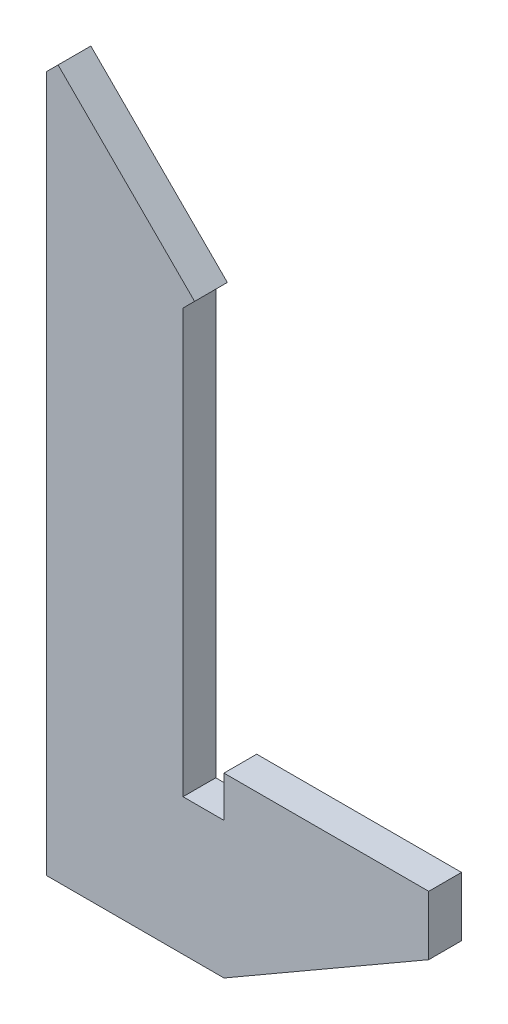
ISO-10303-21;
HEADER;
FILE_DESCRIPTION(('STEP AP214'),'2;1');
FILE_NAME('part.step','',(''),(''),'','','');
FILE_SCHEMA(('AUTOMOTIVE_DESIGN { 1 0 10303 214 1 1 1 1 }'));
ENDSEC;
DATA;
#1=APPLICATION_CONTEXT('core data for automotive mechanical design processes');
#2=APPLICATION_PROTOCOL_DEFINITION('international standard','automotive_design',2000,#1);
#3=PRODUCT_CONTEXT('',#1,'mechanical');
#4=PRODUCT('Part','Part','',(#3));
#5=PRODUCT_RELATED_PRODUCT_CATEGORY('part','',(#4));
#6=PRODUCT_DEFINITION_FORMATION('','',#4);
#7=PRODUCT_DEFINITION_CONTEXT('part definition',#1,'design');
#8=PRODUCT_DEFINITION('design','',#6,#7);
#9=PRODUCT_DEFINITION_SHAPE('','',#8);
#10=(LENGTH_UNIT() NAMED_UNIT(*) SI_UNIT(.MILLI.,.METRE.));
#11=(NAMED_UNIT(*) PLANE_ANGLE_UNIT() SI_UNIT($,.RADIAN.));
#12=(NAMED_UNIT(*) SI_UNIT($,.STERADIAN.) SOLID_ANGLE_UNIT());
#13=UNCERTAINTY_MEASURE_WITH_UNIT(LENGTH_MEASURE(1.E-05),#10,'distance_accuracy_value','');
#14=(GEOMETRIC_REPRESENTATION_CONTEXT(3) GLOBAL_UNCERTAINTY_ASSIGNED_CONTEXT((#13)) GLOBAL_UNIT_ASSIGNED_CONTEXT((#10,
#11,#12)) REPRESENTATION_CONTEXT('',''));
#15=CARTESIAN_POINT('',(0.,0.,0.));
#16=DIRECTION('',(0.,0.,1.));
#17=DIRECTION('',(1.,0.,0.));
#18=AXIS2_PLACEMENT_3D('',#15,#16,#17);
#19=CARTESIAN_POINT('',(-2.71514718625761,3.88485281374241,0.12));
#20=DIRECTION('',(0.707106781186544,-0.707106781186551,0.));
#21=DIRECTION('',(0.707106781186551,0.707106781186544,0.));
#22=AXIS2_PLACEMENT_3D('',#19,#20,#21);
#23=PLANE('',#22);
#24=DIRECTION('',(-0.707106781186551,-0.707106781186544,0.));
#25=VECTOR('',#24,1.);
#26=CARTESIAN_POINT('',(-2.71514718625761,3.88485281374241,-0.12));
#27=LINE('',#26,#25);
#28=CARTESIAN_POINT('',(-2.71514718625761,3.88485281374241,-0.12));
#29=VERTEX_POINT('',#28);
#30=CARTESIAN_POINT('',(-2.8,3.80000000000002,-0.12));
#31=VERTEX_POINT('',#30);
#32=EDGE_CURVE('E150',#29,#31,#27,.T.);
#33=ORIENTED_EDGE('',*,*,#32,.T.);
#34=DIRECTION('',(0.,0.,-1.));
#35=VECTOR('',#34,1.);
#36=CARTESIAN_POINT('',(-2.8,3.80000000000002,0.12));
#37=LINE('',#36,#35);
#38=CARTESIAN_POINT('',(-2.8,3.80000000000002,0.12));
#39=VERTEX_POINT('',#38);
#40=EDGE_CURVE('E11',#39,#31,#37,.T.);
#41=ORIENTED_EDGE('',*,*,#40,.F.);
#42=DIRECTION('',(-0.707106781186551,-0.707106781186544,0.));
#43=VECTOR('',#42,1.);
#44=CARTESIAN_POINT('',(-2.71514718625761,3.88485281374241,0.12));
#45=LINE('',#44,#43);
#46=CARTESIAN_POINT('',(-2.71514718625761,3.88485281374241,0.12));
#47=VERTEX_POINT('',#46);
#48=EDGE_CURVE('E170',#47,#39,#45,.T.);
#49=ORIENTED_EDGE('',*,*,#48,.F.);
#50=DIRECTION('',(0.,0.,-1.));
#51=VECTOR('',#50,1.);
#52=CARTESIAN_POINT('',(-2.71514718625761,3.88485281374241,0.12));
#53=LINE('',#52,#51);
#54=EDGE_CURVE('E146',#47,#29,#53,.T.);
#55=ORIENTED_EDGE('',*,*,#54,.T.);
#56=EDGE_LOOP('',(#33,#41,#49,#55));
#57=FACE_BOUND('',#56,.T.);
#58=ADVANCED_FACE('F36',(#57),#23,.F.);
#59=CARTESIAN_POINT('',(-2.8,3.80000000000002,0.12));
#60=DIRECTION('',(1.,0.,0.));
#61=DIRECTION('',(0.,1.,0.));
#62=AXIS2_PLACEMENT_3D('',#59,#60,#61);
#63=PLANE('',#62);
#64=DIRECTION('',(0.,-1.,0.));
#65=VECTOR('',#64,1.);
#66=CARTESIAN_POINT('',(-2.8,3.80000000000002,-0.12));
#67=LINE('',#66,#65);
#68=CARTESIAN_POINT('',(-2.8,-1.3,-0.12));
#69=VERTEX_POINT('',#68);
#70=EDGE_CURVE('E153',#31,#69,#67,.T.);
#71=ORIENTED_EDGE('',*,*,#70,.T.);
#72=DIRECTION('',(0.,0.,-1.));
#73=VECTOR('',#72,1.);
#74=CARTESIAN_POINT('',(-2.8,-1.3,0.12));
#75=LINE('',#74,#73);
#76=CARTESIAN_POINT('',(-2.8,-1.3,0.12));
#77=VERTEX_POINT('',#76);
#78=EDGE_CURVE('E44',#77,#69,#75,.T.);
#79=ORIENTED_EDGE('',*,*,#78,.F.);
#80=DIRECTION('',(0.,-1.,0.));
#81=VECTOR('',#80,1.);
#82=CARTESIAN_POINT('',(-2.8,3.80000000000002,0.12));
#83=LINE('',#82,#81);
#84=EDGE_CURVE('E104',#39,#77,#83,.T.);
#85=ORIENTED_EDGE('',*,*,#84,.F.);
#86=ORIENTED_EDGE('',*,*,#40,.T.);
#87=EDGE_LOOP('',(#71,#79,#85,#86));
#88=FACE_BOUND('',#87,.T.);
#89=ADVANCED_FACE('F242',(#88),#63,.F.);
#90=CARTESIAN_POINT('',(-2.8,-1.3,0.12));
#91=DIRECTION('',(0.,1.,0.));
#92=DIRECTION('',(0.,0.,1.));
#93=AXIS2_PLACEMENT_3D('',#90,#91,#92);
#94=PLANE('',#93);
#95=DIRECTION('',(1.,0.,0.));
#96=VECTOR('',#95,1.);
#97=CARTESIAN_POINT('',(-2.8,-1.3,-0.12));
#98=LINE('',#97,#96);
#99=CARTESIAN_POINT('',(-1.5,-1.3,-0.12));
#100=VERTEX_POINT('',#99);
#101=EDGE_CURVE('E155',#69,#100,#98,.T.);
#102=ORIENTED_EDGE('',*,*,#101,.T.);
#103=DIRECTION('',(0.,0.,-1.));
#104=VECTOR('',#103,1.);
#105=CARTESIAN_POINT('',(-1.5,-1.3,0.12));
#106=LINE('',#105,#104);
#107=CARTESIAN_POINT('',(-1.5,-1.3,0.12));
#108=VERTEX_POINT('',#107);
#109=EDGE_CURVE('E186',#108,#100,#106,.T.);
#110=ORIENTED_EDGE('',*,*,#109,.F.);
#111=DIRECTION('',(1.,0.,0.));
#112=VECTOR('',#111,1.);
#113=CARTESIAN_POINT('',(-2.8,-1.3,0.12));
#114=LINE('',#113,#112);
#115=EDGE_CURVE('E194',#77,#108,#114,.T.);
#116=ORIENTED_EDGE('',*,*,#115,.F.);
#117=ORIENTED_EDGE('',*,*,#78,.T.);
#118=EDGE_LOOP('',(#102,#110,#116,#117));
#119=FACE_BOUND('',#118,.T.);
#120=ADVANCED_FACE('F192',(#119),#94,.F.);
#121=CARTESIAN_POINT('',(-1.5,-1.3,0.12));
#122=DIRECTION('',(-0.499999999999998,0.86602540378444,0.));
#123=DIRECTION('',(-0.86602540378444,-0.499999999999998,0.));
#124=AXIS2_PLACEMENT_3D('',#121,#122,#123);
#125=PLANE('',#124);
#126=DIRECTION('',(0.86602540378444,0.499999999999998,0.));
#127=VECTOR('',#126,1.);
#128=CARTESIAN_POINT('',(-1.5,-1.3,-0.12));
#129=LINE('',#128,#127);
#130=CARTESIAN_POINT('',(0.,-0.433974596215566,-0.12));
#131=VERTEX_POINT('',#130);
#132=EDGE_CURVE('E157',#100,#131,#129,.T.);
#133=ORIENTED_EDGE('',*,*,#132,.T.);
#134=DIRECTION('',(0.,0.,-1.));
#135=VECTOR('',#134,1.);
#136=CARTESIAN_POINT('',(0.,-0.433974596215566,0.12));
#137=LINE('',#136,#135);
#138=CARTESIAN_POINT('',(0.,-0.433974596215566,0.12));
#139=VERTEX_POINT('',#138);
#140=EDGE_CURVE('E183',#139,#131,#137,.T.);
#141=ORIENTED_EDGE('',*,*,#140,.F.);
#142=DIRECTION('',(0.86602540378444,0.499999999999998,0.));
#143=VECTOR('',#142,1.);
#144=CARTESIAN_POINT('',(-1.5,-1.3,0.12));
#145=LINE('',#144,#143);
#146=EDGE_CURVE('E212',#108,#139,#145,.T.);
#147=ORIENTED_EDGE('',*,*,#146,.F.);
#148=ORIENTED_EDGE('',*,*,#109,.T.);
#149=EDGE_LOOP('',(#133,#141,#147,#148));
#150=FACE_BOUND('',#149,.T.);
#151=ADVANCED_FACE('F203',(#150),#125,.F.);
#152=CARTESIAN_POINT('',(0.,-0.433974596215566,0.12));
#153=DIRECTION('',(-1.,0.,0.));
#154=DIRECTION('',(0.,-1.,0.));
#155=AXIS2_PLACEMENT_3D('',#152,#153,#154);
#156=PLANE('',#155);
#157=DIRECTION('',(0.,1.,0.));
#158=VECTOR('',#157,1.);
#159=CARTESIAN_POINT('',(0.,-0.433974596215566,-0.12));
#160=LINE('',#159,#158);
#161=CARTESIAN_POINT('',(0.,0.,-0.12));
#162=VERTEX_POINT('',#161);
#163=EDGE_CURVE('E159',#131,#162,#160,.T.);
#164=ORIENTED_EDGE('',*,*,#163,.T.);
#165=DIRECTION('',(0.,0.,-1.));
#166=VECTOR('',#165,1.);
#167=CARTESIAN_POINT('',(0.,0.,0.12));
#168=LINE('',#167,#166);
#169=CARTESIAN_POINT('',(0.,0.,0.12));
#170=VERTEX_POINT('',#169);
#171=EDGE_CURVE('E180',#170,#162,#168,.T.);
#172=ORIENTED_EDGE('',*,*,#171,.F.);
#173=DIRECTION('',(0.,1.,0.));
#174=VECTOR('',#173,1.);
#175=CARTESIAN_POINT('',(0.,-0.433974596215566,0.12));
#176=LINE('',#175,#174);
#177=EDGE_CURVE('E209',#139,#170,#176,.T.);
#178=ORIENTED_EDGE('',*,*,#177,.F.);
#179=ORIENTED_EDGE('',*,*,#140,.T.);
#180=EDGE_LOOP('',(#164,#172,#178,#179));
#181=FACE_BOUND('',#180,.T.);
#182=ADVANCED_FACE('F207',(#181),#156,.F.);
#183=CARTESIAN_POINT('',(0.,0.,0.12));
#184=DIRECTION('',(0.,-1.,0.));
#185=DIRECTION('',(0.,0.,-1.));
#186=AXIS2_PLACEMENT_3D('',#183,#184,#185);
#187=PLANE('',#186);
#188=DIRECTION('',(-1.,0.,0.));
#189=VECTOR('',#188,1.);
#190=CARTESIAN_POINT('',(0.,0.,-0.12));
#191=LINE('',#190,#189);
#192=CARTESIAN_POINT('',(-1.5,0.,-0.12));
#193=VERTEX_POINT('',#192);
#194=EDGE_CURVE('E161',#162,#193,#191,.T.);
#195=ORIENTED_EDGE('',*,*,#194,.T.);
#196=DIRECTION('',(0.,0.,-1.));
#197=VECTOR('',#196,1.);
#198=CARTESIAN_POINT('',(-1.5,0.,0.12));
#199=LINE('',#198,#197);
#200=CARTESIAN_POINT('',(-1.5,0.,0.12));
#201=VERTEX_POINT('',#200);
#202=EDGE_CURVE('E177',#201,#193,#199,.T.);
#203=ORIENTED_EDGE('',*,*,#202,.F.);
#204=DIRECTION('',(-1.,0.,0.));
#205=VECTOR('',#204,1.);
#206=CARTESIAN_POINT('',(0.,0.,0.12));
#207=LINE('',#206,#205);
#208=EDGE_CURVE('E211',#170,#201,#207,.T.);
#209=ORIENTED_EDGE('',*,*,#208,.F.);
#210=ORIENTED_EDGE('',*,*,#171,.T.);
#211=EDGE_LOOP('',(#195,#203,#209,#210));
#212=FACE_BOUND('',#211,.T.);
#213=ADVANCED_FACE('F255',(#212),#187,.F.);
#214=CARTESIAN_POINT('',(-1.5,0.,0.12));
#215=DIRECTION('',(1.,0.,0.));
#216=DIRECTION('',(0.,0.,-1.));
#217=AXIS2_PLACEMENT_3D('',#214,#215,#216);
#218=PLANE('',#217);
#219=DIRECTION('',(0.,-1.,0.));
#220=VECTOR('',#219,1.);
#221=CARTESIAN_POINT('',(-1.5,0.,-0.12));
#222=LINE('',#221,#220);
#223=CARTESIAN_POINT('',(-1.5,-0.3,-0.12));
#224=VERTEX_POINT('',#223);
#225=EDGE_CURVE('E163',#193,#224,#222,.T.);
#226=ORIENTED_EDGE('',*,*,#225,.T.);
#227=DIRECTION('',(0.,0.,-1.));
#228=VECTOR('',#227,1.);
#229=CARTESIAN_POINT('',(-1.5,-0.3,0.12));
#230=LINE('',#229,#228);
#231=CARTESIAN_POINT('',(-1.5,-0.3,0.12));
#232=VERTEX_POINT('',#231);
#233=EDGE_CURVE('E174',#232,#224,#230,.T.);
#234=ORIENTED_EDGE('',*,*,#233,.F.);
#235=DIRECTION('',(0.,-1.,0.));
#236=VECTOR('',#235,1.);
#237=CARTESIAN_POINT('',(-1.5,0.,0.12));
#238=LINE('',#237,#236);
#239=EDGE_CURVE('E214',#201,#232,#238,.T.);
#240=ORIENTED_EDGE('',*,*,#239,.F.);
#241=ORIENTED_EDGE('',*,*,#202,.T.);
#242=EDGE_LOOP('',(#226,#234,#240,#241));
#243=FACE_BOUND('',#242,.T.);
#244=ADVANCED_FACE('F223',(#243),#218,.F.);
#245=CARTESIAN_POINT('',(-1.5,-0.3,0.12));
#246=DIRECTION('',(0.,-1.,0.));
#247=DIRECTION('',(1.,0.,0.));
#248=AXIS2_PLACEMENT_3D('',#245,#246,#247);
#249=PLANE('',#248);
#250=DIRECTION('',(-1.,0.,0.));
#251=VECTOR('',#250,1.);
#252=CARTESIAN_POINT('',(-1.5,-0.3,-0.12));
#253=LINE('',#252,#251);
#254=CARTESIAN_POINT('',(-1.8,-0.3,-0.12));
#255=VERTEX_POINT('',#254);
#256=EDGE_CURVE('E165',#224,#255,#253,.T.);
#257=ORIENTED_EDGE('',*,*,#256,.T.);
#258=DIRECTION('',(0.,0.,-1.));
#259=VECTOR('',#258,1.);
#260=CARTESIAN_POINT('',(-1.8,-0.3,0.12));
#261=LINE('',#260,#259);
#262=CARTESIAN_POINT('',(-1.8,-0.3,0.12));
#263=VERTEX_POINT('',#262);
#264=EDGE_CURVE('E141',#263,#255,#261,.T.);
#265=ORIENTED_EDGE('',*,*,#264,.F.);
#266=DIRECTION('',(-1.,0.,0.));
#267=VECTOR('',#266,1.);
#268=CARTESIAN_POINT('',(-1.5,-0.3,0.12));
#269=LINE('',#268,#267);
#270=EDGE_CURVE('E132',#232,#263,#269,.T.);
#271=ORIENTED_EDGE('',*,*,#270,.F.);
#272=ORIENTED_EDGE('',*,*,#233,.T.);
#273=EDGE_LOOP('',(#257,#265,#271,#272));
#274=FACE_BOUND('',#273,.T.);
#275=ADVANCED_FACE('F227',(#274),#249,.F.);
#276=CARTESIAN_POINT('',(-1.8,-0.3,0.12));
#277=DIRECTION('',(-1.,0.,0.));
#278=DIRECTION('',(0.,0.,1.));
#279=AXIS2_PLACEMENT_3D('',#276,#277,#278);
#280=PLANE('',#279);
#281=DIRECTION('',(0.,1.,0.));
#282=VECTOR('',#281,1.);
#283=CARTESIAN_POINT('',(-1.8,-0.3,-0.12));
#284=LINE('',#283,#282);
#285=CARTESIAN_POINT('',(-1.8,2.80000000000001,-0.12));
#286=VERTEX_POINT('',#285);
#287=EDGE_CURVE('E140',#255,#286,#284,.T.);
#288=ORIENTED_EDGE('',*,*,#287,.T.);
#289=DIRECTION('',(0.,0.,-1.));
#290=VECTOR('',#289,1.);
#291=CARTESIAN_POINT('',(-1.8,2.80000000000001,0.12));
#292=LINE('',#291,#290);
#293=CARTESIAN_POINT('',(-1.8,2.80000000000001,0.12));
#294=VERTEX_POINT('',#293);
#295=EDGE_CURVE('E137',#294,#286,#292,.T.);
#296=ORIENTED_EDGE('',*,*,#295,.F.);
#297=DIRECTION('',(0.,1.,0.));
#298=VECTOR('',#297,1.);
#299=CARTESIAN_POINT('',(-1.8,-0.3,0.12));
#300=LINE('',#299,#298);
#301=EDGE_CURVE('E126',#263,#294,#300,.T.);
#302=ORIENTED_EDGE('',*,*,#301,.F.);
#303=ORIENTED_EDGE('',*,*,#264,.T.);
#304=EDGE_LOOP('',(#288,#296,#302,#303));
#305=FACE_BOUND('',#304,.T.);
#306=ADVANCED_FACE('F138',(#305),#280,.F.);
#307=CARTESIAN_POINT('',(-1.8,2.80000000000001,0.12));
#308=DIRECTION('',(-0.707106781186548,0.707106781186547,0.));
#309=DIRECTION('',(-0.707106781186547,-0.707106781186548,0.));
#310=AXIS2_PLACEMENT_3D('',#307,#308,#309);
#311=PLANE('',#310);
#312=DIRECTION('',(0.707106781186547,0.707106781186548,0.));
#313=VECTOR('',#312,1.);
#314=CARTESIAN_POINT('',(-1.8,2.80000000000001,-0.12));
#315=LINE('',#314,#313);
#316=CARTESIAN_POINT('',(-1.71514718625761,2.8848528137424,-0.12));
#317=VERTEX_POINT('',#316);
#318=EDGE_CURVE('E90',#286,#317,#315,.T.);
#319=ORIENTED_EDGE('',*,*,#318,.T.);
#320=DIRECTION('',(0.,0.,-1.));
#321=VECTOR('',#320,1.);
#322=CARTESIAN_POINT('',(-1.71514718625761,2.8848528137424,0.12));
#323=LINE('',#322,#321);
#324=CARTESIAN_POINT('',(-1.71514718625761,2.8848528137424,0.12));
#325=VERTEX_POINT('',#324);
#326=EDGE_CURVE('E142',#325,#317,#323,.T.);
#327=ORIENTED_EDGE('',*,*,#326,.F.);
#328=DIRECTION('',(0.707106781186547,0.707106781186548,0.));
#329=VECTOR('',#328,1.);
#330=CARTESIAN_POINT('',(-1.8,2.80000000000001,0.12));
#331=LINE('',#330,#329);
#332=EDGE_CURVE('E130',#294,#325,#331,.T.);
#333=ORIENTED_EDGE('',*,*,#332,.F.);
#334=ORIENTED_EDGE('',*,*,#295,.T.);
#335=EDGE_LOOP('',(#319,#327,#333,#334));
#336=FACE_BOUND('',#335,.T.);
#337=ADVANCED_FACE('F144',(#336),#311,.F.);
#338=CARTESIAN_POINT('',(-1.71514718625761,2.8848528137424,0.12));
#339=DIRECTION('',(-0.707106781186551,-0.707106781186544,0.));
#340=DIRECTION('',(0.707106781186544,-0.707106781186551,0.));
#341=AXIS2_PLACEMENT_3D('',#338,#339,#340);
#342=PLANE('',#341);
#343=DIRECTION('',(-0.707106781186544,0.707106781186551,0.));
#344=VECTOR('',#343,1.);
#345=CARTESIAN_POINT('',(-1.71514718625761,2.8848528137424,-0.12));
#346=LINE('',#345,#344);
#347=EDGE_CURVE('E96',#317,#29,#346,.T.);
#348=ORIENTED_EDGE('',*,*,#347,.T.);
#349=ORIENTED_EDGE('',*,*,#54,.F.);
#350=DIRECTION('',(-0.707106781186544,0.707106781186551,0.));
#351=VECTOR('',#350,1.);
#352=CARTESIAN_POINT('',(-1.71514718625761,2.8848528137424,0.12));
#353=LINE('',#352,#351);
#354=EDGE_CURVE('E52',#325,#47,#353,.T.);
#355=ORIENTED_EDGE('',*,*,#354,.F.);
#356=ORIENTED_EDGE('',*,*,#326,.T.);
#357=EDGE_LOOP('',(#348,#349,#355,#356));
#358=FACE_BOUND('',#357,.T.);
#359=ADVANCED_FACE('F231',(#358),#342,.F.);
#360=CARTESIAN_POINT('',(0.,0.,0.12));
#361=DIRECTION('',(0.,0.,-1.));
#362=DIRECTION('',(-1.,0.,0.));
#363=AXIS2_PLACEMENT_3D('',#360,#361,#362);
#364=PLANE('',#363);
#365=ORIENTED_EDGE('',*,*,#48,.T.);
#366=ORIENTED_EDGE('',*,*,#84,.T.);
#367=ORIENTED_EDGE('',*,*,#115,.T.);
#368=ORIENTED_EDGE('',*,*,#146,.T.);
#369=ORIENTED_EDGE('',*,*,#177,.T.);
#370=ORIENTED_EDGE('',*,*,#208,.T.);
#371=ORIENTED_EDGE('',*,*,#239,.T.);
#372=ORIENTED_EDGE('',*,*,#270,.T.);
#373=ORIENTED_EDGE('',*,*,#301,.T.);
#374=ORIENTED_EDGE('',*,*,#332,.T.);
#375=ORIENTED_EDGE('',*,*,#354,.T.);
#376=EDGE_LOOP('',(#365,#366,#367,#368,#369,#370,#371,#372,#373,#374,#375));
#377=FACE_BOUND('',#376,.T.);
#378=ADVANCED_FACE('F128',(#377),#364,.F.);
#379=CARTESIAN_POINT('',(0.,0.,-0.12));
#380=DIRECTION('',(0.,0.,-1.));
#381=DIRECTION('',(-1.,0.,0.));
#382=AXIS2_PLACEMENT_3D('',#379,#380,#381);
#383=PLANE('',#382);
#384=ORIENTED_EDGE('',*,*,#32,.F.);
#385=ORIENTED_EDGE('',*,*,#347,.F.);
#386=ORIENTED_EDGE('',*,*,#318,.F.);
#387=ORIENTED_EDGE('',*,*,#287,.F.);
#388=ORIENTED_EDGE('',*,*,#256,.F.);
#389=ORIENTED_EDGE('',*,*,#225,.F.);
#390=ORIENTED_EDGE('',*,*,#194,.F.);
#391=ORIENTED_EDGE('',*,*,#163,.F.);
#392=ORIENTED_EDGE('',*,*,#132,.F.);
#393=ORIENTED_EDGE('',*,*,#101,.F.);
#394=ORIENTED_EDGE('',*,*,#70,.F.);
#395=EDGE_LOOP('',(#384,#385,#386,#387,#388,#389,#390,#391,#392,#393,#394));
#396=FACE_BOUND('',#395,.T.);
#397=ADVANCED_FACE('F198',(#396),#383,.T.);
#398=CLOSED_SHELL('',(#58,#89,#120,#151,#182,#213,#244,#275,#306,#337,#359,#378,#397));
#399=MANIFOLD_SOLID_BREP('B2',#398);
#400=ADVANCED_BREP_SHAPE_REPRESENTATION('',(#18,#399),#14);
#401=SHAPE_DEFINITION_REPRESENTATION(#9,#400);
ENDSEC;
END-ISO-10303-21;
